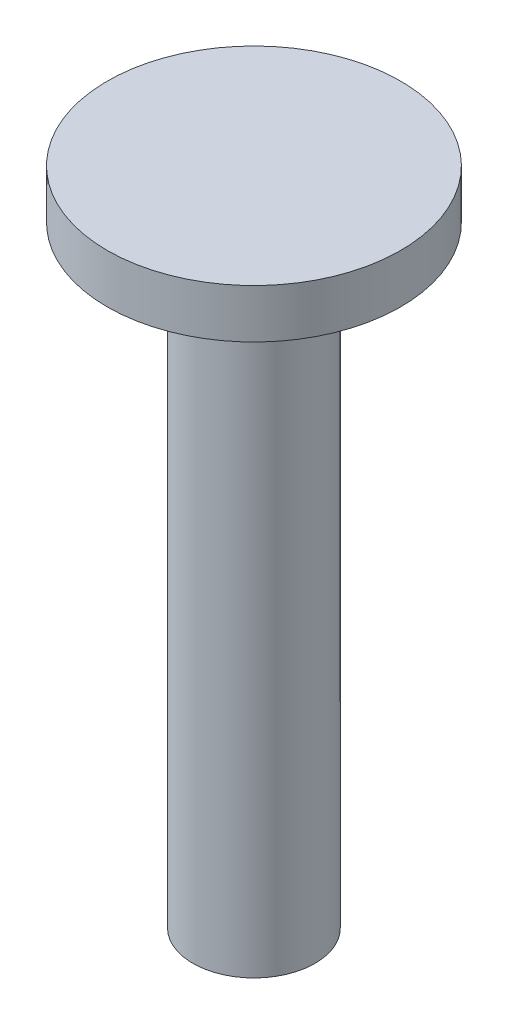
ISO-10303-21;
HEADER;
FILE_DESCRIPTION(('STEP AP214'),'2;1');
FILE_NAME('part.step','',(''),(''),'','','');
FILE_SCHEMA(('AUTOMOTIVE_DESIGN { 1 0 10303 214 1 1 1 1 }'));
ENDSEC;
DATA;
#1=APPLICATION_CONTEXT('core data for automotive mechanical design processes');
#2=APPLICATION_PROTOCOL_DEFINITION('international standard','automotive_design',2000,#1);
#3=PRODUCT_CONTEXT('',#1,'mechanical');
#4=PRODUCT('Part','Part','',(#3));
#5=PRODUCT_RELATED_PRODUCT_CATEGORY('part','',(#4));
#6=PRODUCT_DEFINITION_FORMATION('','',#4);
#7=PRODUCT_DEFINITION_CONTEXT('part definition',#1,'design');
#8=PRODUCT_DEFINITION('design','',#6,#7);
#9=PRODUCT_DEFINITION_SHAPE('','',#8);
#10=(LENGTH_UNIT() NAMED_UNIT(*) SI_UNIT(.MILLI.,.METRE.));
#11=(NAMED_UNIT(*) PLANE_ANGLE_UNIT() SI_UNIT($,.RADIAN.));
#12=(NAMED_UNIT(*) SI_UNIT($,.STERADIAN.) SOLID_ANGLE_UNIT());
#13=UNCERTAINTY_MEASURE_WITH_UNIT(LENGTH_MEASURE(1.E-05),#10,'distance_accuracy_value','');
#14=(GEOMETRIC_REPRESENTATION_CONTEXT(3) GLOBAL_UNCERTAINTY_ASSIGNED_CONTEXT((#13)) GLOBAL_UNIT_ASSIGNED_CONTEXT((#10,
#11,#12)) REPRESENTATION_CONTEXT('',''));
#15=CARTESIAN_POINT('',(0.,0.,0.));
#16=DIRECTION('',(0.,0.,1.));
#17=DIRECTION('',(1.,0.,0.));
#18=AXIS2_PLACEMENT_3D('',#15,#16,#17);
#19=CARTESIAN_POINT('',(0.,0.8,0.));
#20=DIRECTION('',(0.,-1.,0.));
#21=DIRECTION('',(0.,0.,-1.));
#22=AXIS2_PLACEMENT_3D('',#19,#20,#21);
#23=CYLINDRICAL_SURFACE('',#22,2.4);
#24=CARTESIAN_POINT('',(0.,0.8,0.));
#25=DIRECTION('',(0.,1.,0.));
#26=DIRECTION('',(0.,0.,1.));
#27=AXIS2_PLACEMENT_3D('',#24,#25,#26);
#28=CIRCLE('',#27,2.4);
#29=CARTESIAN_POINT('',(0.,0.8,2.4));
#30=VERTEX_POINT('',#29);
#31=EDGE_CURVE('E46',#30,#30,#28,.T.);
#32=ORIENTED_EDGE('',*,*,#31,.F.);
#33=EDGE_LOOP('',(#32));
#34=FACE_BOUND('',#33,.T.);
#35=CARTESIAN_POINT('',(0.,0.,0.));
#36=DIRECTION('',(0.,1.,0.));
#37=DIRECTION('',(0.,0.,1.));
#38=AXIS2_PLACEMENT_3D('',#35,#36,#37);
#39=CIRCLE('',#38,2.4);
#40=CARTESIAN_POINT('',(0.,0.,2.4));
#41=VERTEX_POINT('',#40);
#42=EDGE_CURVE('E42',#41,#41,#39,.T.);
#43=ORIENTED_EDGE('',*,*,#42,.T.);
#44=EDGE_LOOP('',(#43));
#45=FACE_BOUND('',#44,.T.);
#46=ADVANCED_FACE('F39',(#34,#45),#23,.T.);
#47=CARTESIAN_POINT('',(0.,0.8,0.));
#48=DIRECTION('',(0.,1.,0.));
#49=DIRECTION('',(0.,0.,1.));
#50=AXIS2_PLACEMENT_3D('',#47,#48,#49);
#51=PLANE('',#50);
#52=ORIENTED_EDGE('',*,*,#31,.T.);
#53=EDGE_LOOP('',(#52));
#54=FACE_BOUND('',#53,.T.);
#55=ADVANCED_FACE('F63',(#54),#51,.T.);
#56=CARTESIAN_POINT('',(0.,0.,0.));
#57=DIRECTION('',(0.,1.,0.));
#58=DIRECTION('',(0.,0.,1.));
#59=AXIS2_PLACEMENT_3D('',#56,#57,#58);
#60=PLANE('',#59);
#61=CARTESIAN_POINT('',(0.,0.,0.));
#62=DIRECTION('',(0.,-1.,0.));
#63=DIRECTION('',(0.,0.,-1.));
#64=AXIS2_PLACEMENT_3D('',#61,#62,#63);
#65=CIRCLE('',#64,1.);
#66=CARTESIAN_POINT('',(0.,0.,-1.));
#67=VERTEX_POINT('',#66);
#68=EDGE_CURVE('E10',#67,#67,#65,.T.);
#69=ORIENTED_EDGE('',*,*,#68,.F.);
#70=EDGE_LOOP('',(#69));
#71=FACE_BOUND('',#70,.T.);
#72=ORIENTED_EDGE('',*,*,#42,.F.);
#73=EDGE_LOOP('',(#72));
#74=FACE_BOUND('',#73,.T.);
#75=ADVANCED_FACE('F60',(#71,#74),#60,.F.);
#76=CARTESIAN_POINT('',(0.,-10.,0.));
#77=DIRECTION('',(0.,1.,0.));
#78=DIRECTION('',(0.,0.,1.));
#79=AXIS2_PLACEMENT_3D('',#76,#77,#78);
#80=CYLINDRICAL_SURFACE('',#79,1.);
#81=CARTESIAN_POINT('',(0.,-10.,0.));
#82=DIRECTION('',(0.,-1.,0.));
#83=DIRECTION('',(0.,0.,-1.));
#84=AXIS2_PLACEMENT_3D('',#81,#82,#83);
#85=CIRCLE('',#84,1.);
#86=CARTESIAN_POINT('',(0.,-10.,-1.));
#87=VERTEX_POINT('',#86);
#88=EDGE_CURVE('E52',#87,#87,#85,.T.);
#89=ORIENTED_EDGE('',*,*,#88,.F.);
#90=EDGE_LOOP('',(#89));
#91=FACE_BOUND('',#90,.T.);
#92=ORIENTED_EDGE('',*,*,#68,.T.);
#93=EDGE_LOOP('',(#92));
#94=FACE_BOUND('',#93,.T.);
#95=ADVANCED_FACE('F62',(#91,#94),#80,.T.);
#96=CARTESIAN_POINT('',(0.,-10.,0.));
#97=DIRECTION('',(0.,-1.,0.));
#98=DIRECTION('',(0.,0.,-1.));
#99=AXIS2_PLACEMENT_3D('',#96,#97,#98);
#100=PLANE('',#99);
#101=ORIENTED_EDGE('',*,*,#88,.T.);
#102=EDGE_LOOP('',(#101));
#103=FACE_BOUND('',#102,.T.);
#104=ADVANCED_FACE('F69',(#103),#100,.T.);
#105=CLOSED_SHELL('',(#46,#55,#75,#95,#104));
#106=MANIFOLD_SOLID_BREP('B2',#105);
#107=ADVANCED_BREP_SHAPE_REPRESENTATION('',(#18,#106),#14);
#108=SHAPE_DEFINITION_REPRESENTATION(#9,#107);
ENDSEC;
END-ISO-10303-21;
